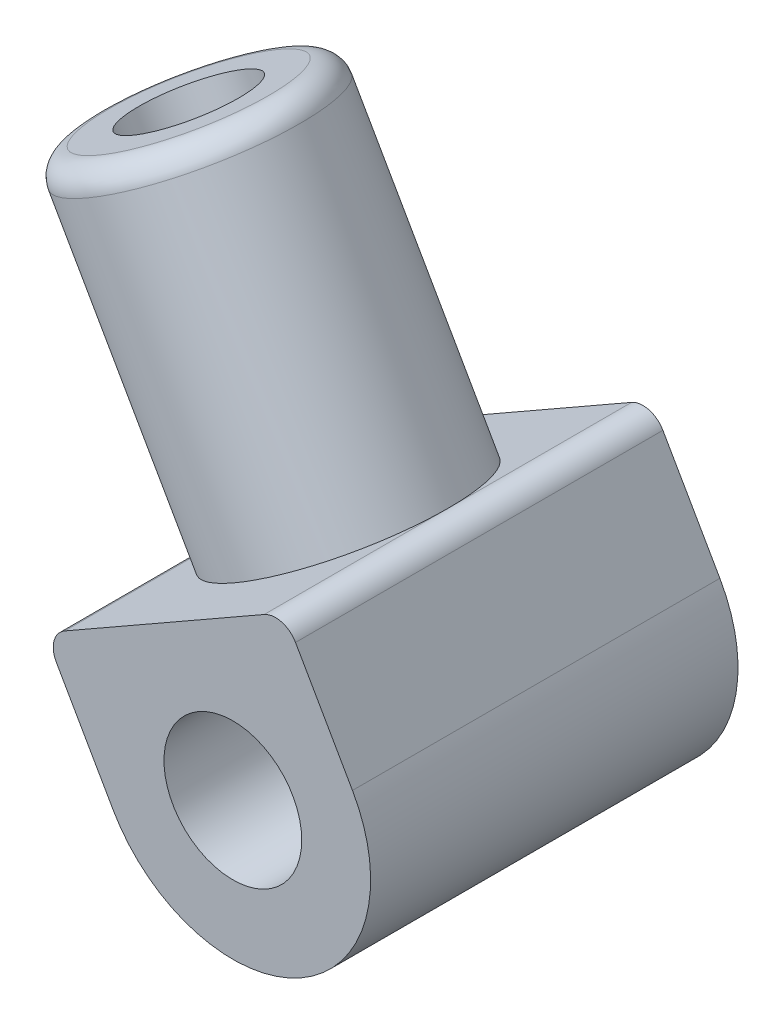
ISO-10303-21;
HEADER;
FILE_DESCRIPTION(('STEP AP214'),'2;1');
FILE_NAME('part.step','',(''),(''),'','','');
FILE_SCHEMA(('AUTOMOTIVE_DESIGN { 1 0 10303 214 1 1 1 1 }'));
ENDSEC;
DATA;
#1=APPLICATION_CONTEXT('core data for automotive mechanical design processes');
#2=APPLICATION_PROTOCOL_DEFINITION('international standard','automotive_design',2000,#1);
#3=PRODUCT_CONTEXT('',#1,'mechanical');
#4=PRODUCT('Part','Part','',(#3));
#5=PRODUCT_RELATED_PRODUCT_CATEGORY('part','',(#4));
#6=PRODUCT_DEFINITION_FORMATION('','',#4);
#7=PRODUCT_DEFINITION_CONTEXT('part definition',#1,'design');
#8=PRODUCT_DEFINITION('design','',#6,#7);
#9=PRODUCT_DEFINITION_SHAPE('','',#8);
#10=(LENGTH_UNIT() NAMED_UNIT(*) SI_UNIT(.MILLI.,.METRE.));
#11=(NAMED_UNIT(*) PLANE_ANGLE_UNIT() SI_UNIT($,.RADIAN.));
#12=(NAMED_UNIT(*) SI_UNIT($,.STERADIAN.) SOLID_ANGLE_UNIT());
#13=UNCERTAINTY_MEASURE_WITH_UNIT(LENGTH_MEASURE(1.E-05),#10,'distance_accuracy_value','');
#14=(GEOMETRIC_REPRESENTATION_CONTEXT(3) GLOBAL_UNCERTAINTY_ASSIGNED_CONTEXT((#13)) GLOBAL_UNIT_ASSIGNED_CONTEXT((#10,
#11,#12)) REPRESENTATION_CONTEXT('',''));
#15=CARTESIAN_POINT('',(0.,0.,0.));
#16=DIRECTION('',(0.,0.,1.));
#17=DIRECTION('',(1.,0.,0.));
#18=AXIS2_PLACEMENT_3D('',#15,#16,#17);
#19=CARTESIAN_POINT('',(31.8137075171123,-17.7673747773942,8.));
#20=DIRECTION('',(0.496138938356834,-0.868243142124459,0.));
#21=DIRECTION('',(0.868243142124459,0.496138938356834,0.));
#22=AXIS2_PLACEMENT_3D('',#19,#20,#21);
#23=PLANE('',#22);
#24=DIRECTION('',(-0.868243142124459,-0.496138938356834,0.));
#25=VECTOR('',#24,1.);
#26=CARTESIAN_POINT('',(31.8137075171123,-17.7673747773942,-8.));
#27=LINE('',#26,#25);
#28=CARTESIAN_POINT('',(41.3643820804813,-12.3098464554691,-8.));
#29=VERTEX_POINT('',#28);
#30=CARTESIAN_POINT('',(32.6819506592367,-17.2712358390374,-8.));
#31=VERTEX_POINT('',#30);
#32=EDGE_CURVE('E110',#29,#31,#27,.T.);
#33=ORIENTED_EDGE('',*,*,#32,.T.);
#34=DIRECTION('',(0.,0.,-1.));
#35=VECTOR('',#34,1.);
#36=CARTESIAN_POINT('',(32.6819506592367,-17.2712358390374,8.));
#37=LINE('',#36,#35);
#38=CARTESIAN_POINT('',(32.6819506592367,-17.2712358390374,0.));
#39=VERTEX_POINT('',#38);
#40=EDGE_CURVE('E135',#31,#39,#37,.F.);
#41=ORIENTED_EDGE('',*,*,#40,.T.);
#42=CARTESIAN_POINT('',(37.023166369859,-14.7905411472532,0.));
#43=DIRECTION('',(0.496138938356834,-0.868243142124459,0.));
#44=DIRECTION('',(0.868243142124459,0.496138938356834,0.));
#45=AXIS2_PLACEMENT_3D('',#42,#43,#44);
#46=CIRCLE('',#45,5.);
#47=CARTESIAN_POINT('',(41.3643820804813,-12.3098464554691,0.));
#48=VERTEX_POINT('',#47);
#49=EDGE_CURVE('E120',#48,#39,#46,.F.);
#50=ORIENTED_EDGE('',*,*,#49,.F.);
#51=DIRECTION('',(0.,0.,-1.));
#52=VECTOR('',#51,1.);
#53=CARTESIAN_POINT('',(41.3643820804813,-12.3098464554691,8.));
#54=LINE('',#53,#52);
#55=EDGE_CURVE('E129',#48,#29,#54,.T.);
#56=ORIENTED_EDGE('',*,*,#55,.T.);
#57=EDGE_LOOP('',(#33,#41,#50,#56));
#58=FACE_BOUND('',#57,.T.);
#59=ADVANCED_FACE('F17',(#58),#23,.F.);
#60=CARTESIAN_POINT('',(40.,-20.,8.));
#61=DIRECTION('',(0.,0.,1.));
#62=DIRECTION('',(1.,0.,0.));
#63=AXIS2_PLACEMENT_3D('',#60,#61,#62);
#64=PLANE('',#63);
#65=DIRECTION('',(-0.868243142124459,-0.496138938356834,0.));
#66=VECTOR('',#65,1.);
#67=CARTESIAN_POINT('',(31.8137075171123,-17.7673747773942,8.));
#68=LINE('',#67,#66);
#69=CARTESIAN_POINT('',(41.3643820804813,-12.3098464554691,8.));
#70=VERTEX_POINT('',#69);
#71=CARTESIAN_POINT('',(32.6819506592367,-17.2712358390374,8.));
#72=VERTEX_POINT('',#71);
#73=EDGE_CURVE('E91',#70,#72,#68,.T.);
#74=ORIENTED_EDGE('',*,*,#73,.T.);
#75=CARTESIAN_POINT('',(33.1780895975936,-18.1394789811619,8.));
#76=DIRECTION('',(0.,0.,1.));
#77=DIRECTION('',(1.,0.,0.));
#78=AXIS2_PLACEMENT_3D('',#75,#76,#77);
#79=CIRCLE('',#78,1.);
#80=CARTESIAN_POINT('',(32.3098464554691,-18.6356179195187,8.));
#81=VERTEX_POINT('',#80);
#82=EDGE_CURVE('E87',#72,#81,#79,.T.);
#83=ORIENTED_EDGE('',*,*,#82,.T.);
#84=DIRECTION('',(0.496138938356835,-0.868243142124459,0.));
#85=VECTOR('',#84,1.);
#86=CARTESIAN_POINT('',(31.8137075171123,-17.7673747773942,8.));
#87=LINE('',#86,#85);
#88=CARTESIAN_POINT('',(34.7905411472533,-22.976833630141,8.));
#89=VERTEX_POINT('',#88);
#90=EDGE_CURVE('E79',#81,#89,#87,.T.);
#91=ORIENTED_EDGE('',*,*,#90,.T.);
#92=CARTESIAN_POINT('',(40.,-20.,8.));
#93=DIRECTION('',(0.,0.,1.));
#94=DIRECTION('',(1.,0.,0.));
#95=AXIS2_PLACEMENT_3D('',#92,#93,#94);
#96=CIRCLE('',#95,6.);
#97=CARTESIAN_POINT('',(45.2094588527468,-17.023166369859,8.));
#98=VERTEX_POINT('',#97);
#99=EDGE_CURVE('E84',#89,#98,#96,.T.);
#100=ORIENTED_EDGE('',*,*,#99,.T.);
#101=DIRECTION('',(-0.496138938356833,0.868243142124459,0.));
#102=VECTOR('',#101,1.);
#103=CARTESIAN_POINT('',(42.2326252226057,-11.8137075171122,8.));
#104=LINE('',#103,#102);
#105=CARTESIAN_POINT('',(42.7287641609626,-12.6819506592367,8.));
#106=VERTEX_POINT('',#105);
#107=EDGE_CURVE('E105',#98,#106,#104,.T.);
#108=ORIENTED_EDGE('',*,*,#107,.T.);
#109=CARTESIAN_POINT('',(41.8605210188381,-13.1780895975935,8.));
#110=DIRECTION('',(0.,0.,1.));
#111=DIRECTION('',(1.,0.,0.));
#112=AXIS2_PLACEMENT_3D('',#109,#110,#111);
#113=CIRCLE('',#112,1.);
#114=EDGE_CURVE('E137',#106,#70,#113,.T.);
#115=ORIENTED_EDGE('',*,*,#114,.T.);
#116=EDGE_LOOP('',(#74,#83,#91,#100,#108,#115));
#117=FACE_BOUND('',#116,.T.);
#118=CARTESIAN_POINT('',(40.,-20.,8.));
#119=DIRECTION('',(0.,0.,1.));
#120=DIRECTION('',(1.,0.,0.));
#121=AXIS2_PLACEMENT_3D('',#118,#119,#120);
#122=CIRCLE('',#121,3.);
#123=CARTESIAN_POINT('',(43.,-20.,8.));
#124=VERTEX_POINT('',#123);
#125=EDGE_CURVE('E113',#124,#124,#122,.T.);
#126=ORIENTED_EDGE('',*,*,#125,.F.);
#127=EDGE_LOOP('',(#126));
#128=FACE_BOUND('',#127,.T.);
#129=ADVANCED_FACE('F81',(#117,#128),#64,.T.);
#130=CARTESIAN_POINT('',(40.,-20.,-8.));
#131=DIRECTION('',(0.,0.,1.));
#132=DIRECTION('',(1.,0.,0.));
#133=AXIS2_PLACEMENT_3D('',#130,#131,#132);
#134=PLANE('',#133);
#135=DIRECTION('',(0.496138938356835,-0.868243142124459,0.));
#136=VECTOR('',#135,1.);
#137=CARTESIAN_POINT('',(31.8137075171123,-17.7673747773942,-8.));
#138=LINE('',#137,#136);
#139=CARTESIAN_POINT('',(32.3098464554691,-18.6356179195187,-8.));
#140=VERTEX_POINT('',#139);
#141=CARTESIAN_POINT('',(34.7905411472533,-22.976833630141,-8.));
#142=VERTEX_POINT('',#141);
#143=EDGE_CURVE('E97',#140,#142,#138,.T.);
#144=ORIENTED_EDGE('',*,*,#143,.F.);
#145=CARTESIAN_POINT('',(33.1780895975936,-18.1394789811619,-8.));
#146=DIRECTION('',(0.,0.,1.));
#147=DIRECTION('',(1.,0.,0.));
#148=AXIS2_PLACEMENT_3D('',#145,#146,#147);
#149=CIRCLE('',#148,1.);
#150=EDGE_CURVE('E127',#140,#31,#149,.F.);
#151=ORIENTED_EDGE('',*,*,#150,.T.);
#152=ORIENTED_EDGE('',*,*,#32,.F.);
#153=CARTESIAN_POINT('',(41.8605210188381,-13.1780895975935,-8.));
#154=DIRECTION('',(0.,0.,1.));
#155=DIRECTION('',(1.,0.,0.));
#156=AXIS2_PLACEMENT_3D('',#153,#154,#155);
#157=CIRCLE('',#156,1.);
#158=CARTESIAN_POINT('',(42.7287641609626,-12.6819506592367,-8.));
#159=VERTEX_POINT('',#158);
#160=EDGE_CURVE('E125',#29,#159,#157,.F.);
#161=ORIENTED_EDGE('',*,*,#160,.T.);
#162=DIRECTION('',(-0.496138938356833,0.868243142124459,0.));
#163=VECTOR('',#162,1.);
#164=CARTESIAN_POINT('',(42.2326252226057,-11.8137075171122,-8.));
#165=LINE('',#164,#163);
#166=CARTESIAN_POINT('',(45.2094588527468,-17.023166369859,-8.));
#167=VERTEX_POINT('',#166);
#168=EDGE_CURVE('E117',#167,#159,#165,.T.);
#169=ORIENTED_EDGE('',*,*,#168,.F.);
#170=CARTESIAN_POINT('',(40.,-20.,-8.));
#171=DIRECTION('',(0.,0.,1.));
#172=DIRECTION('',(1.,0.,0.));
#173=AXIS2_PLACEMENT_3D('',#170,#171,#172);
#174=CIRCLE('',#173,6.);
#175=EDGE_CURVE('E115',#142,#167,#174,.T.);
#176=ORIENTED_EDGE('',*,*,#175,.F.);
#177=EDGE_LOOP('',(#144,#151,#152,#161,#169,#176));
#178=FACE_BOUND('',#177,.T.);
#179=CARTESIAN_POINT('',(40.,-20.,-8.));
#180=DIRECTION('',(0.,0.,1.));
#181=DIRECTION('',(1.,0.,0.));
#182=AXIS2_PLACEMENT_3D('',#179,#180,#181);
#183=CIRCLE('',#182,3.);
#184=CARTESIAN_POINT('',(43.,-20.,-8.));
#185=VERTEX_POINT('',#184);
#186=EDGE_CURVE('E192',#185,#185,#183,.T.);
#187=ORIENTED_EDGE('',*,*,#186,.T.);
#188=EDGE_LOOP('',(#187));
#189=FACE_BOUND('',#188,.T.);
#190=ADVANCED_FACE('F164',(#178,#189),#134,.F.);
#191=EDGE_CURVE('E100',#39,#48,#46,.F.);
#192=ORIENTED_EDGE('',*,*,#191,.F.);
#193=DIRECTION('',(0.,0.,-1.));
#194=VECTOR('',#193,1.);
#195=CARTESIAN_POINT('',(32.6819506592367,-17.2712358390374,8.));
#196=LINE('',#195,#194);
#197=EDGE_CURVE('E40',#39,#72,#196,.F.);
#198=ORIENTED_EDGE('',*,*,#197,.T.);
#199=ORIENTED_EDGE('',*,*,#73,.F.);
#200=DIRECTION('',(0.,0.,-1.));
#201=VECTOR('',#200,1.);
#202=CARTESIAN_POINT('',(41.3643820804813,-12.3098464554691,8.));
#203=LINE('',#202,#201);
#204=EDGE_CURVE('E131',#70,#48,#203,.T.);
#205=ORIENTED_EDGE('',*,*,#204,.T.);
#206=EDGE_LOOP('',(#192,#198,#199,#205));
#207=FACE_BOUND('',#206,.T.);
#208=ADVANCED_FACE('F160',(#207),#23,.F.);
#209=CARTESIAN_POINT('',(31.8137075171123,-17.7673747773942,8.));
#210=DIRECTION('',(0.868243142124459,0.496138938356835,0.));
#211=DIRECTION('',(-0.496138938356835,0.868243142124459,0.));
#212=AXIS2_PLACEMENT_3D('',#209,#210,#211);
#213=PLANE('',#212);
#214=ORIENTED_EDGE('',*,*,#90,.F.);
#215=DIRECTION('',(0.,0.,-1.));
#216=VECTOR('',#215,1.);
#217=CARTESIAN_POINT('',(32.3098464554691,-18.6356179195187,8.));
#218=LINE('',#217,#216);
#219=EDGE_CURVE('E123',#81,#140,#218,.T.);
#220=ORIENTED_EDGE('',*,*,#219,.T.);
#221=ORIENTED_EDGE('',*,*,#143,.T.);
#222=DIRECTION('',(0.,0.,-1.));
#223=VECTOR('',#222,1.);
#224=CARTESIAN_POINT('',(34.7905411472533,-22.976833630141,8.));
#225=LINE('',#224,#223);
#226=EDGE_CURVE('E94',#89,#142,#225,.T.);
#227=ORIENTED_EDGE('',*,*,#226,.F.);
#228=EDGE_LOOP('',(#214,#220,#221,#227));
#229=FACE_BOUND('',#228,.T.);
#230=ADVANCED_FACE('F95',(#229),#213,.F.);
#231=CARTESIAN_POINT('',(40.,-20.,8.));
#232=DIRECTION('',(0.,0.,-1.));
#233=DIRECTION('',(-1.,0.,0.));
#234=AXIS2_PLACEMENT_3D('',#231,#232,#233);
#235=CYLINDRICAL_SURFACE('',#234,6.);
#236=ORIENTED_EDGE('',*,*,#175,.T.);
#237=DIRECTION('',(0.,0.,-1.));
#238=VECTOR('',#237,1.);
#239=CARTESIAN_POINT('',(45.2094588527468,-17.023166369859,8.));
#240=LINE('',#239,#238);
#241=EDGE_CURVE('E101',#98,#167,#240,.T.);
#242=ORIENTED_EDGE('',*,*,#241,.F.);
#243=ORIENTED_EDGE('',*,*,#99,.F.);
#244=ORIENTED_EDGE('',*,*,#226,.T.);
#245=EDGE_LOOP('',(#236,#242,#243,#244));
#246=FACE_BOUND('',#245,.T.);
#247=ADVANCED_FACE('F103',(#246),#235,.T.);
#248=CARTESIAN_POINT('',(42.2326252226057,-11.8137075171122,8.));
#249=DIRECTION('',(-0.86824314212446,-0.496138938356833,0.));
#250=DIRECTION('',(0.496138938356833,-0.86824314212446,0.));
#251=AXIS2_PLACEMENT_3D('',#248,#249,#250);
#252=PLANE('',#251);
#253=ORIENTED_EDGE('',*,*,#168,.T.);
#254=DIRECTION('',(0.,0.,-1.));
#255=VECTOR('',#254,1.);
#256=CARTESIAN_POINT('',(42.7287641609626,-12.6819506592367,8.));
#257=LINE('',#256,#255);
#258=EDGE_CURVE('E32',#159,#106,#257,.F.);
#259=ORIENTED_EDGE('',*,*,#258,.T.);
#260=ORIENTED_EDGE('',*,*,#107,.F.);
#261=ORIENTED_EDGE('',*,*,#241,.T.);
#262=EDGE_LOOP('',(#253,#259,#260,#261));
#263=FACE_BOUND('',#262,.T.);
#264=ADVANCED_FACE('F188',(#263),#252,.F.);
#265=CARTESIAN_POINT('',(40.,-20.,8.));
#266=DIRECTION('',(0.,0.,-1.));
#267=DIRECTION('',(-1.,0.,0.));
#268=AXIS2_PLACEMENT_3D('',#265,#266,#267);
#269=CYLINDRICAL_SURFACE('',#268,3.);
#270=ORIENTED_EDGE('',*,*,#125,.T.);
#271=EDGE_LOOP('',(#270));
#272=FACE_BOUND('',#271,.T.);
#273=ORIENTED_EDGE('',*,*,#186,.F.);
#274=EDGE_LOOP('',(#273));
#275=FACE_BOUND('',#274,.T.);
#276=ADVANCED_FACE('F206',(#272,#275),#269,.F.);
#277=CARTESIAN_POINT('',(30.0772212328634,-2.63513715751082,0.));
#278=DIRECTION('',(-0.496138938356834,0.868243142124459,0.));
#279=DIRECTION('',(-0.868243142124459,-0.496138938356834,0.));
#280=AXIS2_PLACEMENT_3D('',#277,#278,#279);
#281=PLANE('',#280);
#282=CARTESIAN_POINT('',(30.0772212328634,-2.63513715751082,0.));
#283=DIRECTION('',(-0.496138938356834,0.868243142124459,0.));
#284=DIRECTION('',(-0.868243142124459,-0.496138938356834,0.));
#285=AXIS2_PLACEMENT_3D('',#282,#283,#284);
#286=CIRCLE('',#285,4.);
#287=CARTESIAN_POINT('',(26.6042486643655,-4.61969291093816,0.));
#288=VERTEX_POINT('',#287);
#289=EDGE_CURVE('E25',#288,#288,#286,.T.);
#290=ORIENTED_EDGE('',*,*,#289,.T.);
#291=EDGE_LOOP('',(#290));
#292=FACE_BOUND('',#291,.T.);
#293=CARTESIAN_POINT('',(30.0772212328634,-2.63513715751082,0.));
#294=DIRECTION('',(-0.496138938356834,0.868243142124459,0.));
#295=DIRECTION('',(-0.868243142124459,-0.496138938356834,0.));
#296=AXIS2_PLACEMENT_3D('',#293,#294,#295);
#297=CIRCLE('',#296,2.5);
#298=CARTESIAN_POINT('',(32.2478290881745,-1.39478981161873,0.));
#299=VERTEX_POINT('',#298);
#300=EDGE_CURVE('E195',#299,#299,#297,.T.);
#301=ORIENTED_EDGE('',*,*,#300,.F.);
#302=EDGE_LOOP('',(#301));
#303=FACE_BOUND('',#302,.T.);
#304=ADVANCED_FACE('F143',(#292,#303),#281,.T.);
#305=CARTESIAN_POINT('',(30.0772212328634,-2.63513715751082,0.));
#306=DIRECTION('',(0.496138938356834,-0.868243142124459,0.));
#307=DIRECTION('',(0.868243142124459,0.496138938356834,0.));
#308=AXIS2_PLACEMENT_3D('',#305,#306,#307);
#309=CYLINDRICAL_SURFACE('',#308,5.);
#310=CARTESIAN_POINT('',(30.5733601712201,-3.50338029963528,0.));
#311=DIRECTION('',(-0.496138938356834,0.868243142124459,0.));
#312=DIRECTION('',(-0.868243142124459,-0.496138938356834,0.));
#313=AXIS2_PLACEMENT_3D('',#310,#311,#312);
#314=CIRCLE('',#313,5.);
#315=CARTESIAN_POINT('',(26.2321444605979,-5.98407499141945,0.));
#316=VERTEX_POINT('',#315);
#317=EDGE_CURVE('E11',#316,#316,#314,.F.);
#318=ORIENTED_EDGE('',*,*,#317,.T.);
#319=EDGE_LOOP('',(#318));
#320=FACE_BOUND('',#319,.T.);
#321=ORIENTED_EDGE('',*,*,#49,.T.);
#322=ORIENTED_EDGE('',*,*,#191,.T.);
#323=EDGE_LOOP('',(#321,#322));
#324=FACE_BOUND('',#323,.T.);
#325=ADVANCED_FACE('F182',(#320,#324),#309,.T.);
#326=CARTESIAN_POINT('',(30.0772212328634,-2.63513715751082,0.));
#327=DIRECTION('',(0.496138938356834,-0.868243142124459,0.));
#328=DIRECTION('',(0.868243142124459,0.496138938356834,0.));
#329=AXIS2_PLACEMENT_3D('',#326,#327,#328);
#330=CYLINDRICAL_SURFACE('',#329,2.5);
#331=CARTESIAN_POINT('',(37.023166369859,-14.7905411472532,0.));
#332=DIRECTION('',(-0.496138938356834,0.868243142124459,0.));
#333=DIRECTION('',(-0.868243142124459,-0.496138938356834,0.));
#334=AXIS2_PLACEMENT_3D('',#331,#332,#333);
#335=CIRCLE('',#334,2.5);
#336=CARTESIAN_POINT('',(39.1937742251702,-13.5501938013611,0.));
#337=VERTEX_POINT('',#336);
#338=EDGE_CURVE('E198',#337,#337,#335,.T.);
#339=CARTESIAN_POINT('',(32.2478290881745,-1.39478981161873,0.));
#340=CARTESIAN_POINT('',(32.3201826833515,-1.52140860317855,0.));
#341=CARTESIAN_POINT('',(32.3925362785286,-1.64802739473837,0.));
#342=CARTESIAN_POINT('',(32.5372434688827,-1.901264977858,0.));
#343=CARTESIAN_POINT('',(32.6095970640597,-2.02788376941782,0.));
#344=CARTESIAN_POINT('',(32.7543042544138,-2.28112135253745,0.));
#345=CARTESIAN_POINT('',(32.8266578495908,-2.40774014409727,0.));
#346=CARTESIAN_POINT('',(32.9713650399449,-2.6609777272169,0.));
#347=CARTESIAN_POINT('',(33.0437186351219,-2.78759651877672,0.));
#348=CARTESIAN_POINT('',(33.188425825476,-3.04083410189635,0.));
#349=CARTESIAN_POINT('',(33.260779420653,-3.16745289345617,0.));
#350=CARTESIAN_POINT('',(33.4054866110071,-3.4206904765758,0.));
#351=CARTESIAN_POINT('',(33.4778402061841,-3.54730926813562,0.));
#352=CARTESIAN_POINT('',(33.6225473965382,-3.80054685125525,0.));
#353=CARTESIAN_POINT('',(33.6949009917153,-3.92716564281507,0.));
#354=CARTESIAN_POINT('',(33.8396081820693,-4.1804032259347,0.));
#355=CARTESIAN_POINT('',(33.9119617772464,-4.30702201749452,0.));
#356=CARTESIAN_POINT('',(34.0566689676005,-4.56025960061415,0.));
#357=CARTESIAN_POINT('',(34.1290225627775,-4.68687839217397,0.));
#358=CARTESIAN_POINT('',(34.2737297531316,-4.9401159752936,0.));
#359=CARTESIAN_POINT('',(34.3460833483086,-5.06673476685342,0.));
#360=CARTESIAN_POINT('',(34.4907905386627,-5.31997234997305,0.));
#361=CARTESIAN_POINT('',(34.5631441338397,-5.44659114153287,0.));
#362=CARTESIAN_POINT('',(34.7078513241938,-5.69982872465251,0.));
#363=CARTESIAN_POINT('',(34.7802049193708,-5.82644751621232,0.));
#364=CARTESIAN_POINT('',(34.9249121097249,-6.07968509933195,0.));
#365=CARTESIAN_POINT('',(34.997265704902,-6.20630389089177,0.));
#366=CARTESIAN_POINT('',(35.141972895256,-6.4595414740114,0.));
#367=CARTESIAN_POINT('',(35.2143264904331,-6.58616026557122,0.));
#368=CARTESIAN_POINT('',(35.3590336807871,-6.83939784869086,0.));
#369=CARTESIAN_POINT('',(35.4313872759642,-6.96601664025067,0.));
#370=CARTESIAN_POINT('',(35.5760944663183,-7.21925422337031,0.));
#371=CARTESIAN_POINT('',(35.6484480614953,-7.34587301493012,0.));
#372=CARTESIAN_POINT('',(35.7931552518494,-7.59911059804976,0.));
#373=CARTESIAN_POINT('',(35.8655088470264,-7.72572938960957,0.));
#374=CARTESIAN_POINT('',(36.0102160373805,-7.97896697272921,0.));
#375=CARTESIAN_POINT('',(36.0825696325575,-8.10558576428902,0.));
#376=CARTESIAN_POINT('',(36.2272768229116,-8.35882334740866,0.));
#377=CARTESIAN_POINT('',(36.2996304180886,-8.48544213896847,0.));
#378=CARTESIAN_POINT('',(36.4443376084427,-8.73867972208811,0.));
#379=CARTESIAN_POINT('',(36.5166912036198,-8.86529851364792,0.));
#380=CARTESIAN_POINT('',(36.6613983939738,-9.11853609676756,0.));
#381=CARTESIAN_POINT('',(36.7337519891509,-9.24515488832737,0.));
#382=CARTESIAN_POINT('',(36.8784591795049,-9.49839247144701,0.));
#383=CARTESIAN_POINT('',(36.950812774682,-9.62501126300682,0.));
#384=CARTESIAN_POINT('',(37.0955199650361,-9.87824884612646,0.));
#385=CARTESIAN_POINT('',(37.1678735602131,-10.0048676376863,0.));
#386=CARTESIAN_POINT('',(37.3125807505672,-10.2581052208059,0.));
#387=CARTESIAN_POINT('',(37.3849343457442,-10.3847240123657,0.));
#388=CARTESIAN_POINT('',(37.5296415360983,-10.6379615954854,0.));
#389=CARTESIAN_POINT('',(37.6019951312753,-10.7645803870452,0.));
#390=CARTESIAN_POINT('',(37.7467023216294,-11.0178179701648,0.));
#391=CARTESIAN_POINT('',(37.8190559168064,-11.1444367617246,0.));
#392=CARTESIAN_POINT('',(37.9637631071605,-11.3976743448443,0.));
#393=CARTESIAN_POINT('',(38.0361167023376,-11.5242931364041,0.));
#394=CARTESIAN_POINT('',(38.1808238926916,-11.7775307195237,0.));
#395=CARTESIAN_POINT('',(38.2531774878687,-11.9041495110835,0.));
#396=CARTESIAN_POINT('',(38.3978846782227,-12.1573870942032,0.));
#397=CARTESIAN_POINT('',(38.4702382733998,-12.284005885763,0.));
#398=CARTESIAN_POINT('',(38.6149454637539,-12.5372434688826,0.));
#399=CARTESIAN_POINT('',(38.6872990589309,-12.6638622604424,0.));
#400=CARTESIAN_POINT('',(38.832006249285,-12.9170998435621,0.));
#401=CARTESIAN_POINT('',(38.904359844462,-13.0437186351219,0.));
#402=CARTESIAN_POINT('',(39.0490670348161,-13.2969562182415,0.));
#403=CARTESIAN_POINT('',(39.1214206299931,-13.4235750098013,0.));
#404=CARTESIAN_POINT('',(39.1937742251702,-13.5501938013611,0.));
#405=B_SPLINE_CURVE_WITH_KNOTS('',3,(#339,#340,#341,#342,#343,#344,#345,#346,#347,#348,#349,
#350,#351,#352,#353,#354,#355,#356,#357,#358,#359,#360,#361,#362,#363,#364,#365,#366,#367,#368,
#369,#370,#371,#372,#373,#374,#375,#376,#377,#378,#379,#380,#381,#382,#383,#384,#385,#386,#387,
#388,#389,#390,#391,#392,#393,#394,#395,#396,#397,#398,#399,#400,#401,#402,#403,#404),
.UNSPECIFIED.,.F.,.F.,(4,2,2,2,2,2,2,2,2,2,2,2,2,2,2,2,2,2,2,2,2,2,2,2,2,2,2,2,2,2,2,2,4),(0.,
0.437499999999998,0.874999999999998,1.3125,1.75,2.1875,2.62499999999999,3.0625,3.5,
3.93749999999999,4.37499999999999,4.81249999999999,5.24999999999999,5.68749999999999,
6.12499999999999,6.56249999999999,6.99999999999999,7.43749999999999,7.87499999999998,
8.31249999999998,8.74999999999999,9.18749999999998,9.62499999999998,10.0625,10.5,10.9375,11.375,
11.8125,12.25,12.6875,13.125,13.5625,14.),.UNSPECIFIED.);
#406=EDGE_CURVE('BSEAM169',#299,#337,#405,.T.);
#407=ORIENTED_EDGE('',*,*,#300,.T.);
#408=ORIENTED_EDGE('',*,*,#338,.F.);
#409=ORIENTED_EDGE('',*,*,#406,.T.);
#410=ORIENTED_EDGE('',*,*,#406,.F.);
#411=EDGE_LOOP('',(#407,#409,#408,#410));
#412=FACE_BOUND('',#411,.T.);
#413=ADVANCED_FACE('F169',(#412),#330,.F.);
#414=ORIENTED_EDGE('',*,*,#338,.T.);
#415=EDGE_LOOP('',(#414));
#416=FACE_BOUND('',#415,.T.);
#417=ADVANCED_FACE('F159',(#416),#23,.F.);
#418=CARTESIAN_POINT('',(33.1780895975936,-18.1394789811619,8.));
#419=DIRECTION('',(0.,0.,-1.));
#420=DIRECTION('',(-1.,0.,0.));
#421=AXIS2_PLACEMENT_3D('',#418,#419,#420);
#422=CYLINDRICAL_SURFACE('',#421,1.);
#423=ORIENTED_EDGE('',*,*,#197,.F.);
#424=ORIENTED_EDGE('',*,*,#40,.F.);
#425=ORIENTED_EDGE('',*,*,#150,.F.);
#426=ORIENTED_EDGE('',*,*,#219,.F.);
#427=ORIENTED_EDGE('',*,*,#82,.F.);
#428=EDGE_LOOP('',(#423,#424,#425,#426,#427));
#429=FACE_BOUND('',#428,.T.);
#430=ADVANCED_FACE('F153',(#429),#422,.T.);
#431=CARTESIAN_POINT('',(41.8605210188381,-13.1780895975935,8.));
#432=DIRECTION('',(0.,0.,-1.));
#433=DIRECTION('',(-1.,0.,0.));
#434=AXIS2_PLACEMENT_3D('',#431,#432,#433);
#435=CYLINDRICAL_SURFACE('',#434,1.);
#436=ORIENTED_EDGE('',*,*,#114,.F.);
#437=ORIENTED_EDGE('',*,*,#258,.F.);
#438=ORIENTED_EDGE('',*,*,#160,.F.);
#439=ORIENTED_EDGE('',*,*,#55,.F.);
#440=ORIENTED_EDGE('',*,*,#204,.F.);
#441=EDGE_LOOP('',(#436,#437,#438,#439,#440));
#442=FACE_BOUND('',#441,.T.);
#443=ADVANCED_FACE('F147',(#442),#435,.T.);
#444=CARTESIAN_POINT('',(30.5733601712201,-3.50338029963528,0.));
#445=DIRECTION('',(-0.496138938356834,0.868243142124459,0.));
#446=DIRECTION('',(-0.868243142124459,-0.496138938356834,0.));
#447=AXIS2_PLACEMENT_3D('',#444,#445,#446);
#448=TOROIDAL_SURFACE('',#447,4.,1.);
#449=ORIENTED_EDGE('',*,*,#317,.F.);
#450=EDGE_LOOP('',(#449));
#451=FACE_BOUND('',#450,.T.);
#452=ORIENTED_EDGE('',*,*,#289,.F.);
#453=EDGE_LOOP('',(#452));
#454=FACE_BOUND('',#453,.T.);
#455=ADVANCED_FACE('F19',(#451,#454),#448,.T.);
#456=CLOSED_SHELL('',(#59,#129,#190,#208,#230,#247,#264,#276,#304,#325,#413,#417,#430,#443,#455));
#457=MANIFOLD_SOLID_BREP('B1',#456);
#458=ADVANCED_BREP_SHAPE_REPRESENTATION('',(#18,#457),#14);
#459=SHAPE_DEFINITION_REPRESENTATION(#9,#458);
ENDSEC;
END-ISO-10303-21;
